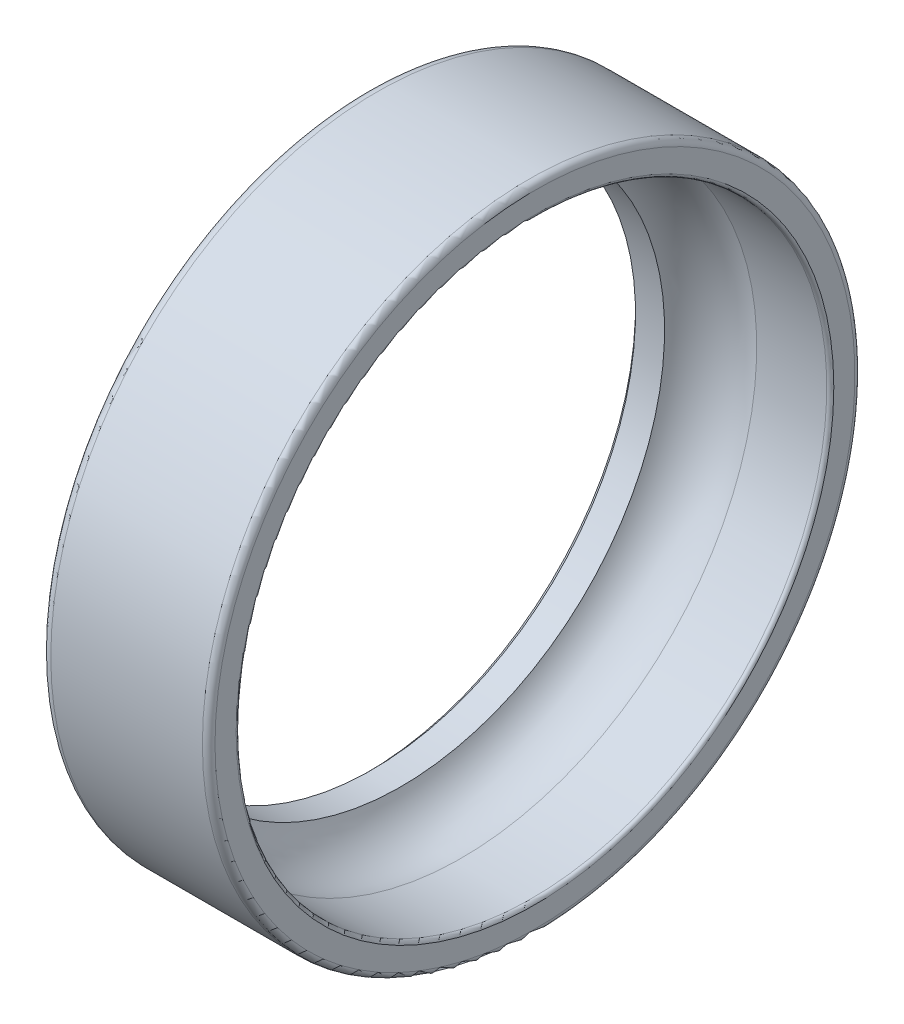
ISO-10303-21;
HEADER;
FILE_DESCRIPTION(('STEP AP214'),'2;1');
FILE_NAME('part.step','',(''),(''),'','','');
FILE_SCHEMA(('AUTOMOTIVE_DESIGN { 1 0 10303 214 1 1 1 1 }'));
ENDSEC;
DATA;
#1=APPLICATION_CONTEXT('core data for automotive mechanical design processes');
#2=APPLICATION_PROTOCOL_DEFINITION('international standard','automotive_design',2000,#1);
#3=PRODUCT_CONTEXT('',#1,'mechanical');
#4=PRODUCT('Part','Part','',(#3));
#5=PRODUCT_RELATED_PRODUCT_CATEGORY('part','',(#4));
#6=PRODUCT_DEFINITION_FORMATION('','',#4);
#7=PRODUCT_DEFINITION_CONTEXT('part definition',#1,'design');
#8=PRODUCT_DEFINITION('design','',#6,#7);
#9=PRODUCT_DEFINITION_SHAPE('','',#8);
#10=(LENGTH_UNIT() NAMED_UNIT(*) SI_UNIT(.MILLI.,.METRE.));
#11=(NAMED_UNIT(*) PLANE_ANGLE_UNIT() SI_UNIT($,.RADIAN.));
#12=(NAMED_UNIT(*) SI_UNIT($,.STERADIAN.) SOLID_ANGLE_UNIT());
#13=UNCERTAINTY_MEASURE_WITH_UNIT(LENGTH_MEASURE(1.E-05),#10,'distance_accuracy_value','');
#14=(GEOMETRIC_REPRESENTATION_CONTEXT(3) GLOBAL_UNCERTAINTY_ASSIGNED_CONTEXT((#13)) GLOBAL_UNIT_ASSIGNED_CONTEXT((#10,
#11,#12)) REPRESENTATION_CONTEXT('',''));
#15=CARTESIAN_POINT('',(0.,0.,0.));
#16=DIRECTION('',(0.,0.,1.));
#17=DIRECTION('',(1.,0.,0.));
#18=AXIS2_PLACEMENT_3D('',#15,#16,#17);
#19=CARTESIAN_POINT('',(0.,-30.5572903122836,-30.));
#20=DIRECTION('',(-1.,0.,0.));
#21=DIRECTION('',(0.,0.,1.));
#22=AXIS2_PLACEMENT_3D('',#19,#20,#21);
#23=PLANE('',#22);
#24=CARTESIAN_POINT('',(0.,0.,0.));
#25=DIRECTION('',(-1.,0.,0.));
#26=DIRECTION('',(0.,0.,-1.));
#27=AXIS2_PLACEMENT_3D('',#24,#25,#26);
#28=CIRCLE('',#27,30.);
#29=CARTESIAN_POINT('',(0.,0.,-30.));
#30=VERTEX_POINT('',#29);
#31=EDGE_CURVE('E49',#30,#30,#28,.F.);
#32=ORIENTED_EDGE('',*,*,#31,.F.);
#33=EDGE_LOOP('',(#32));
#34=FACE_BOUND('',#33,.T.);
#35=CARTESIAN_POINT('',(0.,0.,0.));
#36=DIRECTION('',(1.,0.,0.));
#37=DIRECTION('',(0.,0.,1.));
#38=AXIS2_PLACEMENT_3D('',#35,#36,#37);
#39=CIRCLE('',#38,25.55);
#40=CARTESIAN_POINT('',(0.,0.,25.55));
#41=VERTEX_POINT('',#40);
#42=EDGE_CURVE('E46',#41,#41,#39,.T.);
#43=ORIENTED_EDGE('',*,*,#42,.T.);
#44=EDGE_LOOP('',(#43));
#45=FACE_BOUND('',#44,.T.);
#46=ADVANCED_FACE('F14',(#34,#45),#23,.T.);
#47=CARTESIAN_POINT('',(16.,-30.9647208497807,30.4));
#48=DIRECTION('',(1.,0.,0.));
#49=DIRECTION('',(0.,0.,-1.));
#50=AXIS2_PLACEMENT_3D('',#47,#48,#49);
#51=PLANE('',#50);
#52=CARTESIAN_POINT('',(16.,0.,0.));
#53=DIRECTION('',(1.,0.,0.));
#54=DIRECTION('',(0.,0.,1.));
#55=AXIS2_PLACEMENT_3D('',#52,#53,#54);
#56=CIRCLE('',#55,30.4);
#57=CARTESIAN_POINT('',(16.,0.,30.4));
#58=VERTEX_POINT('',#57);
#59=EDGE_CURVE('E43',#58,#58,#56,.T.);
#60=ORIENTED_EDGE('',*,*,#59,.T.);
#61=EDGE_LOOP('',(#60));
#62=FACE_BOUND('',#61,.T.);
#63=CARTESIAN_POINT('',(16.,0.,0.));
#64=DIRECTION('',(-1.,0.,0.));
#65=DIRECTION('',(0.,0.,-1.));
#66=AXIS2_PLACEMENT_3D('',#63,#64,#65);
#67=CIRCLE('',#66,28.3933334037541);
#68=CARTESIAN_POINT('',(16.,0.,-28.3933334037541));
#69=VERTEX_POINT('',#68);
#70=EDGE_CURVE('E40',#69,#69,#67,.F.);
#71=ORIENTED_EDGE('',*,*,#70,.F.);
#72=EDGE_LOOP('',(#71));
#73=FACE_BOUND('',#72,.T.);
#74=ADVANCED_FACE('F57',(#62,#73),#51,.T.);
#75=CARTESIAN_POINT('',(0.,0.,0.));
#76=DIRECTION('',(-1.,0.,0.));
#77=DIRECTION('',(0.,0.,-1.));
#78=AXIS2_PLACEMENT_3D('',#75,#76,#77);
#79=CONICAL_SURFACE('',#78,25.55,0.785398163397444);
#80=ORIENTED_EDGE('',*,*,#42,.F.);
#81=EDGE_LOOP('',(#80));
#82=FACE_BOUND('',#81,.T.);
#83=CARTESIAN_POINT('',(0.5,0.,0.));
#84=DIRECTION('',(1.,0.,0.));
#85=DIRECTION('',(0.,0.,1.));
#86=AXIS2_PLACEMENT_3D('',#83,#84,#85);
#87=CIRCLE('',#86,25.05);
#88=CARTESIAN_POINT('',(0.5,0.,25.05));
#89=VERTEX_POINT('',#88);
#90=EDGE_CURVE('E37',#89,#89,#87,.T.);
#91=ORIENTED_EDGE('',*,*,#90,.T.);
#92=EDGE_LOOP('',(#91));
#93=FACE_BOUND('',#92,.T.);
#94=ADVANCED_FACE('F61',(#82,#93),#79,.F.);
#95=CARTESIAN_POINT('',(16.,0.,0.));
#96=DIRECTION('',(1.,0.,0.));
#97=DIRECTION('',(0.,0.,1.));
#98=AXIS2_PLACEMENT_3D('',#95,#96,#97);
#99=CYLINDRICAL_SURFACE('',#98,25.05);
#100=CARTESIAN_POINT('',(3.2652412680264,0.,0.));
#101=DIRECTION('',(1.,0.,0.));
#102=DIRECTION('',(0.,0.,1.));
#103=AXIS2_PLACEMENT_3D('',#100,#101,#102);
#104=CIRCLE('',#103,25.05);
#105=CARTESIAN_POINT('',(3.2652412680264,0.,25.05));
#106=VERTEX_POINT('',#105);
#107=EDGE_CURVE('E34',#106,#106,#104,.T.);
#108=ORIENTED_EDGE('',*,*,#107,.T.);
#109=EDGE_LOOP('',(#108));
#110=FACE_BOUND('',#109,.T.);
#111=ORIENTED_EDGE('',*,*,#90,.F.);
#112=EDGE_LOOP('',(#111));
#113=FACE_BOUND('',#112,.T.);
#114=ADVANCED_FACE('F64',(#110,#113),#99,.F.);
#115=CARTESIAN_POINT('',(8.0000000000007,0.,0.));
#116=DIRECTION('',(1.,0.,0.));
#117=DIRECTION('',(0.,0.,1.));
#118=AXIS2_PLACEMENT_3D('',#115,#116,#117);
#119=TOROIDAL_SURFACE('',#118,22.9999999999986,5.15950000000121);
#120=ORIENTED_EDGE('',*,*,#107,.F.);
#121=EDGE_LOOP('',(#120));
#122=FACE_BOUND('',#121,.T.);
#123=CARTESIAN_POINT('',(9.0083849711296,0.,0.));
#124=DIRECTION('',(1.,0.,0.));
#125=DIRECTION('',(0.,-1.92347348819258E-10,1.));
#126=AXIS2_PLACEMENT_3D('',#123,#124,#125);
#127=CIRCLE('',#126,28.06);
#128=CARTESIAN_POINT('',(9.0083849711296,-5.39726660786838E-09,28.06));
#129=VERTEX_POINT('',#128);
#130=EDGE_CURVE('E29',#129,#129,#127,.T.);
#131=ORIENTED_EDGE('',*,*,#130,.T.);
#132=EDGE_LOOP('',(#131));
#133=FACE_BOUND('',#132,.T.);
#134=ADVANCED_FACE('F69',(#122,#133),#119,.F.);
#135=CARTESIAN_POINT('',(16.,0.,0.));
#136=DIRECTION('',(1.,0.,0.));
#137=DIRECTION('',(0.,0.,1.));
#138=AXIS2_PLACEMENT_3D('',#135,#136,#137);
#139=CYLINDRICAL_SURFACE('',#138,28.06);
#140=CARTESIAN_POINT('',(15.666666666667,0.,0.));
#141=DIRECTION('',(1.,0.,0.));
#142=DIRECTION('',(0.,0.,1.));
#143=AXIS2_PLACEMENT_3D('',#140,#141,#142);
#144=CIRCLE('',#143,28.06);
#145=CARTESIAN_POINT('',(15.666666666667,0.,28.06));
#146=VERTEX_POINT('',#145);
#147=EDGE_CURVE('E25',#146,#146,#144,.T.);
#148=ORIENTED_EDGE('',*,*,#147,.T.);
#149=EDGE_LOOP('',(#148));
#150=FACE_BOUND('',#149,.T.);
#151=ORIENTED_EDGE('',*,*,#130,.F.);
#152=EDGE_LOOP('',(#151));
#153=FACE_BOUND('',#152,.T.);
#154=ADVANCED_FACE('F76',(#150,#153),#139,.F.);
#155=CARTESIAN_POINT('',(15.6666666666661,0.,0.));
#156=DIRECTION('',(1.,0.,0.));
#157=DIRECTION('',(0.,7.69344710501027E-10,1.));
#158=AXIS2_PLACEMENT_3D('',#155,#156,#157);
#159=TOROIDAL_SURFACE('',#158,28.3933333333339,0.333333333333956);
#160=ORIENTED_EDGE('',*,*,#70,.T.);
#161=EDGE_LOOP('',(#160));
#162=FACE_BOUND('',#161,.T.);
#163=ORIENTED_EDGE('',*,*,#147,.F.);
#164=EDGE_LOOP('',(#163));
#165=FACE_BOUND('',#164,.T.);
#166=ADVANCED_FACE('F83',(#162,#165),#159,.T.);
#167=CARTESIAN_POINT('',(15.4000000000003,0.,0.));
#168=DIRECTION('',(1.,0.,0.));
#169=DIRECTION('',(0.,0.,1.));
#170=AXIS2_PLACEMENT_3D('',#167,#168,#169);
#171=TOROIDAL_SURFACE('',#170,30.4,0.599999999999748);
#172=CARTESIAN_POINT('',(15.4000000000003,0.,0.));
#173=DIRECTION('',(1.,0.,0.));
#174=DIRECTION('',(0.,0.,1.));
#175=AXIS2_PLACEMENT_3D('',#172,#173,#174);
#176=CIRCLE('',#175,30.9999999999998);
#177=CARTESIAN_POINT('',(15.4000000000003,0.,30.9999999999998));
#178=VERTEX_POINT('',#177);
#179=EDGE_CURVE('E21',#178,#178,#176,.T.);
#180=ORIENTED_EDGE('',*,*,#179,.T.);
#181=EDGE_LOOP('',(#180));
#182=FACE_BOUND('',#181,.T.);
#183=ORIENTED_EDGE('',*,*,#59,.F.);
#184=EDGE_LOOP('',(#183));
#185=FACE_BOUND('',#184,.T.);
#186=ADVANCED_FACE('F87',(#182,#185),#171,.T.);
#187=CARTESIAN_POINT('',(16.,0.,0.));
#188=DIRECTION('',(1.,0.,0.));
#189=DIRECTION('',(0.,0.,1.));
#190=AXIS2_PLACEMENT_3D('',#187,#188,#189);
#191=CYLINDRICAL_SURFACE('',#190,31.);
#192=CARTESIAN_POINT('',(1.,0.,0.));
#193=DIRECTION('',(1.,0.,0.));
#194=DIRECTION('',(0.,0.,1.));
#195=AXIS2_PLACEMENT_3D('',#192,#193,#194);
#196=CIRCLE('',#195,31.);
#197=CARTESIAN_POINT('',(1.,0.,31.));
#198=VERTEX_POINT('',#197);
#199=EDGE_CURVE('E10',#198,#198,#196,.T.);
#200=ORIENTED_EDGE('',*,*,#199,.T.);
#201=EDGE_LOOP('',(#200));
#202=FACE_BOUND('',#201,.T.);
#203=ORIENTED_EDGE('',*,*,#179,.F.);
#204=EDGE_LOOP('',(#203));
#205=FACE_BOUND('',#204,.T.);
#206=ADVANCED_FACE('F90',(#202,#205),#191,.T.);
#207=CARTESIAN_POINT('',(0.99999999999922,0.,0.));
#208=DIRECTION('',(1.,0.,0.));
#209=DIRECTION('',(0.,0.,1.));
#210=AXIS2_PLACEMENT_3D('',#207,#208,#209);
#211=TOROIDAL_SURFACE('',#210,30.0000000000008,0.99999999999922);
#212=ORIENTED_EDGE('',*,*,#31,.T.);
#213=EDGE_LOOP('',(#212));
#214=FACE_BOUND('',#213,.T.);
#215=ORIENTED_EDGE('',*,*,#199,.F.);
#216=EDGE_LOOP('',(#215));
#217=FACE_BOUND('',#216,.T.);
#218=ADVANCED_FACE('F16',(#214,#217),#211,.T.);
#219=CLOSED_SHELL('',(#46,#74,#94,#114,#134,#154,#166,#186,#206,#218));
#220=MANIFOLD_SOLID_BREP('B1',#219);
#221=ADVANCED_BREP_SHAPE_REPRESENTATION('',(#18,#220),#14);
#222=SHAPE_DEFINITION_REPRESENTATION(#9,#221);
ENDSEC;
END-ISO-10303-21;
